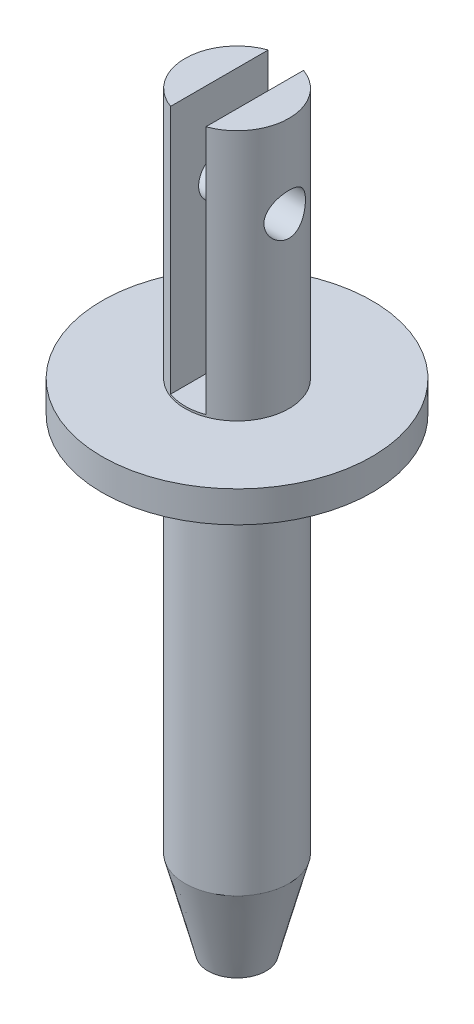
ISO-10303-21;
HEADER;
FILE_DESCRIPTION(('STEP AP214'),'2;1');
FILE_NAME('part.step','',(''),(''),'','','');
FILE_SCHEMA(('AUTOMOTIVE_DESIGN { 1 0 10303 214 1 1 1 1 }'));
ENDSEC;
DATA;
#1=APPLICATION_CONTEXT('core data for automotive mechanical design processes');
#2=APPLICATION_PROTOCOL_DEFINITION('international standard','automotive_design',2000,#1);
#3=PRODUCT_CONTEXT('',#1,'mechanical');
#4=PRODUCT('Part','Part','',(#3));
#5=PRODUCT_RELATED_PRODUCT_CATEGORY('part','',(#4));
#6=PRODUCT_DEFINITION_FORMATION('','',#4);
#7=PRODUCT_DEFINITION_CONTEXT('part definition',#1,'design');
#8=PRODUCT_DEFINITION('design','',#6,#7);
#9=PRODUCT_DEFINITION_SHAPE('','',#8);
#10=(LENGTH_UNIT() NAMED_UNIT(*) SI_UNIT(.MILLI.,.METRE.));
#11=(NAMED_UNIT(*) PLANE_ANGLE_UNIT() SI_UNIT($,.RADIAN.));
#12=(NAMED_UNIT(*) SI_UNIT($,.STERADIAN.) SOLID_ANGLE_UNIT());
#13=UNCERTAINTY_MEASURE_WITH_UNIT(LENGTH_MEASURE(1.E-05),#10,'distance_accuracy_value','');
#14=(GEOMETRIC_REPRESENTATION_CONTEXT(3) GLOBAL_UNCERTAINTY_ASSIGNED_CONTEXT((#13)) GLOBAL_UNIT_ASSIGNED_CONTEXT((#10,
#11,#12)) REPRESENTATION_CONTEXT('',''));
#15=CARTESIAN_POINT('',(0.,0.,0.));
#16=DIRECTION('',(0.,0.,1.));
#17=DIRECTION('',(1.,0.,0.));
#18=AXIS2_PLACEMENT_3D('',#15,#16,#17);
#19=CARTESIAN_POINT('',(0.,36.1,0.));
#20=DIRECTION('',(0.,-1.,0.));
#21=DIRECTION('',(0.,0.,-1.));
#22=AXIS2_PLACEMENT_3D('',#19,#20,#21);
#23=CYLINDRICAL_SURFACE('',#22,2.5);
#24=CARTESIAN_POINT('',(0.,22.4974323745046,0.));
#25=DIRECTION('',(0.,1.,0.));
#26=DIRECTION('',(0.,0.,1.));
#27=AXIS2_PLACEMENT_3D('',#24,#25,#26);
#28=CIRCLE('',#27,2.5);
#29=CARTESIAN_POINT('',(0.,22.4974323745046,2.5));
#30=VERTEX_POINT('',#29);
#31=EDGE_CURVE('E106',#30,#30,#28,.T.);
#32=ORIENTED_EDGE('',*,*,#31,.F.);
#33=EDGE_LOOP('',(#32));
#34=FACE_BOUND('',#33,.T.);
#35=CARTESIAN_POINT('',(0.,4.2000000000001,0.));
#36=DIRECTION('',(0.,1.,0.));
#37=DIRECTION('',(0.,0.,1.));
#38=AXIS2_PLACEMENT_3D('',#35,#36,#37);
#39=CIRCLE('',#38,2.5);
#40=CARTESIAN_POINT('',(0.,4.2000000000001,2.5));
#41=VERTEX_POINT('',#40);
#42=EDGE_CURVE('E41',#41,#41,#39,.T.);
#43=ORIENTED_EDGE('',*,*,#42,.T.);
#44=EDGE_LOOP('',(#43));
#45=FACE_BOUND('',#44,.T.);
#46=ADVANCED_FACE('F33',(#34,#45),#23,.T.);
#47=CARTESIAN_POINT('',(0.,0.,0.));
#48=DIRECTION('',(0.,1.,0.));
#49=DIRECTION('',(0.,0.,1.));
#50=AXIS2_PLACEMENT_3D('',#47,#48,#49);
#51=PLANE('',#50);
#52=CARTESIAN_POINT('',(0.,0.,0.));
#53=DIRECTION('',(0.,1.,0.));
#54=DIRECTION('',(0.,0.,1.));
#55=AXIS2_PLACEMENT_3D('',#52,#53,#54);
#56=CIRCLE('',#55,1.39999999999999);
#57=CARTESIAN_POINT('',(0.,0.,1.39999999999999));
#58=VERTEX_POINT('',#57);
#59=EDGE_CURVE('E11',#58,#58,#56,.F.);
#60=ORIENTED_EDGE('',*,*,#59,.T.);
#61=EDGE_LOOP('',(#60));
#62=FACE_BOUND('',#61,.T.);
#63=ADVANCED_FACE('F153',(#62),#51,.F.);
#64=CARTESIAN_POINT('',(0.,4.2000000000001,0.));
#65=DIRECTION('',(0.,1.,0.));
#66=DIRECTION('',(0.,0.,1.));
#67=AXIS2_PLACEMENT_3D('',#64,#65,#66);
#68=CONICAL_SURFACE('',#67,2.5,0.2561513825656);
#69=ORIENTED_EDGE('',*,*,#59,.F.);
#70=EDGE_LOOP('',(#69));
#71=FACE_BOUND('',#70,.T.);
#72=ORIENTED_EDGE('',*,*,#42,.F.);
#73=EDGE_LOOP('',(#72));
#74=FACE_BOUND('',#73,.T.);
#75=ADVANCED_FACE('F35',(#71,#74),#68,.T.);
#76=CARTESIAN_POINT('',(0.,22.4974323745046,2.5));
#77=DIRECTION('',(0.,-1.,0.));
#78=DIRECTION('',(0.,0.,-1.));
#79=AXIS2_PLACEMENT_3D('',#76,#77,#78);
#80=PLANE('',#79);
#81=ORIENTED_EDGE('',*,*,#31,.T.);
#82=EDGE_LOOP('',(#81));
#83=FACE_BOUND('',#82,.T.);
#84=CARTESIAN_POINT('',(0.,22.4974323745046,0.));
#85=DIRECTION('',(0.,1.,0.));
#86=DIRECTION('',(0.,0.,1.));
#87=AXIS2_PLACEMENT_3D('',#84,#85,#86);
#88=CIRCLE('',#87,6.5);
#89=CARTESIAN_POINT('',(0.,22.4974323745046,6.5));
#90=VERTEX_POINT('',#89);
#91=EDGE_CURVE('E185',#90,#90,#88,.T.);
#92=ORIENTED_EDGE('',*,*,#91,.F.);
#93=EDGE_LOOP('',(#92));
#94=FACE_BOUND('',#93,.T.);
#95=ADVANCED_FACE('F139',(#83,#94),#80,.T.);
#96=CARTESIAN_POINT('',(0.,50.,0.));
#97=DIRECTION('',(0.,1.,0.));
#98=DIRECTION('',(0.,0.,1.));
#99=AXIS2_PLACEMENT_3D('',#96,#97,#98);
#100=CYLINDRICAL_SURFACE('',#99,6.5);
#101=ORIENTED_EDGE('',*,*,#91,.T.);
#102=EDGE_LOOP('',(#101));
#103=FACE_BOUND('',#102,.T.);
#104=CARTESIAN_POINT('',(0.,23.9974323745046,0.));
#105=DIRECTION('',(0.,1.,0.));
#106=DIRECTION('',(0.,0.,1.));
#107=AXIS2_PLACEMENT_3D('',#104,#105,#106);
#108=CIRCLE('',#107,6.5);
#109=CARTESIAN_POINT('',(0.,23.9974323745046,6.5));
#110=VERTEX_POINT('',#109);
#111=EDGE_CURVE('E188',#110,#110,#108,.T.);
#112=ORIENTED_EDGE('',*,*,#111,.F.);
#113=EDGE_LOOP('',(#112));
#114=FACE_BOUND('',#113,.T.);
#115=ADVANCED_FACE('F195',(#103,#114),#100,.T.);
#116=CARTESIAN_POINT('',(0.,23.9974323745046,2.5));
#117=DIRECTION('',(0.,1.,0.));
#118=DIRECTION('',(0.,0.,1.));
#119=AXIS2_PLACEMENT_3D('',#116,#117,#118);
#120=PLANE('',#119);
#121=ORIENTED_EDGE('',*,*,#111,.T.);
#122=EDGE_LOOP('',(#121));
#123=FACE_BOUND('',#122,.T.);
#124=CARTESIAN_POINT('',(0.,23.9974323745046,0.));
#125=DIRECTION('',(0.,1.,0.));
#126=DIRECTION('',(0.,0.,1.));
#127=AXIS2_PLACEMENT_3D('',#124,#125,#126);
#128=CIRCLE('',#127,2.5);
#129=CARTESIAN_POINT('',(0.,23.9974323745046,2.5));
#130=VERTEX_POINT('',#129);
#131=EDGE_CURVE('E174',#130,#130,#128,.T.);
#132=ORIENTED_EDGE('',*,*,#131,.F.);
#133=EDGE_LOOP('',(#132));
#134=FACE_BOUND('',#133,.T.);
#135=ADVANCED_FACE('F152',(#123,#134),#120,.T.);
#136=CARTESIAN_POINT('',(0.,36.1,0.));
#137=DIRECTION('',(0.,1.,0.));
#138=DIRECTION('',(0.,0.,1.));
#139=AXIS2_PLACEMENT_3D('',#136,#137,#138);
#140=PLANE('',#139);
#141=DIRECTION('',(0.,0.,-1.));
#142=VECTOR('',#141,1.);
#143=CARTESIAN_POINT('',(0.85,36.1,0.));
#144=LINE('',#143,#142);
#145=CARTESIAN_POINT('',(0.85,36.1,2.35106358910175));
#146=VERTEX_POINT('',#145);
#147=CARTESIAN_POINT('',(0.85,36.1,-2.35106358910175));
#148=VERTEX_POINT('',#147);
#149=EDGE_CURVE('E73',#146,#148,#144,.T.);
#150=ORIENTED_EDGE('',*,*,#149,.F.);
#151=CARTESIAN_POINT('',(0.,36.1,0.));
#152=DIRECTION('',(0.,1.,0.));
#153=DIRECTION('',(0.,0.,1.));
#154=AXIS2_PLACEMENT_3D('',#151,#152,#153);
#155=CIRCLE('',#154,2.5);
#156=EDGE_CURVE('E82',#146,#148,#155,.T.);
#157=ORIENTED_EDGE('',*,*,#156,.T.);
#158=EDGE_LOOP('',(#150,#157));
#159=FACE_BOUND('',#158,.T.);
#160=ADVANCED_FACE('F92',(#159),#140,.T.);
#161=CARTESIAN_POINT('',(0.85,24.1,3.40914739194886));
#162=DIRECTION('',(1.,0.,0.));
#163=DIRECTION('',(0.,0.,-1.));
#164=AXIS2_PLACEMENT_3D('',#161,#162,#163);
#165=PLANE('',#164);
#166=CARTESIAN_POINT('',(0.85,32.1,0.));
#167=DIRECTION('',(1.,0.,0.));
#168=DIRECTION('',(0.,0.,-1.));
#169=AXIS2_PLACEMENT_3D('',#166,#167,#168);
#170=CIRCLE('',#169,1.);
#171=CARTESIAN_POINT('',(0.85,32.1,-1.));
#172=VERTEX_POINT('',#171);
#173=EDGE_CURVE('E103',#172,#172,#170,.T.);
#174=ORIENTED_EDGE('',*,*,#173,.T.);
#175=EDGE_LOOP('',(#174));
#176=FACE_BOUND('',#175,.T.);
#177=ORIENTED_EDGE('',*,*,#149,.T.);
#178=DIRECTION('',(0.,-1.,0.));
#179=VECTOR('',#178,1.);
#180=CARTESIAN_POINT('',(0.85,36.1,-2.35106358910175));
#181=LINE('',#180,#179);
#182=CARTESIAN_POINT('',(0.85,24.1,-2.35106358910175));
#183=VERTEX_POINT('',#182);
#184=EDGE_CURVE('E76',#183,#148,#181,.F.);
#185=ORIENTED_EDGE('',*,*,#184,.F.);
#186=DIRECTION('',(0.,0.,-1.));
#187=VECTOR('',#186,1.);
#188=CARTESIAN_POINT('',(0.85,24.1,3.40914739194886));
#189=LINE('',#188,#187);
#190=CARTESIAN_POINT('',(0.85,24.1,2.35106358910175));
#191=VERTEX_POINT('',#190);
#192=EDGE_CURVE('E90',#191,#183,#189,.T.);
#193=ORIENTED_EDGE('',*,*,#192,.F.);
#194=DIRECTION('',(0.,-1.,0.));
#195=VECTOR('',#194,1.);
#196=CARTESIAN_POINT('',(0.85,36.1,2.35106358910175));
#197=LINE('',#196,#195);
#198=EDGE_CURVE('E48',#146,#191,#197,.T.);
#199=ORIENTED_EDGE('',*,*,#198,.F.);
#200=EDGE_LOOP('',(#177,#185,#193,#199));
#201=FACE_BOUND('',#200,.T.);
#202=ADVANCED_FACE('F75',(#176,#201),#165,.F.);
#203=CARTESIAN_POINT('',(0.,24.1,0.));
#204=DIRECTION('',(0.,1.,0.));
#205=DIRECTION('',(0.,0.,1.));
#206=AXIS2_PLACEMENT_3D('',#203,#204,#205);
#207=PLANE('',#206);
#208=CARTESIAN_POINT('',(0.,24.1,0.));
#209=DIRECTION('',(0.,1.,0.));
#210=DIRECTION('',(0.,0.,1.));
#211=AXIS2_PLACEMENT_3D('',#208,#209,#210);
#212=CIRCLE('',#211,2.5);
#213=CARTESIAN_POINT('',(-0.85,24.1,-2.35106358910175));
#214=VERTEX_POINT('',#213);
#215=EDGE_CURVE('E89',#183,#214,#212,.T.);
#216=ORIENTED_EDGE('',*,*,#215,.T.);
#217=DIRECTION('',(0.,0.,1.));
#218=VECTOR('',#217,1.);
#219=CARTESIAN_POINT('',(-0.85,24.1,3.40914739194886));
#220=LINE('',#219,#218);
#221=CARTESIAN_POINT('',(-0.85,24.1,2.35106358910175));
#222=VERTEX_POINT('',#221);
#223=EDGE_CURVE('E112',#214,#222,#220,.T.);
#224=ORIENTED_EDGE('',*,*,#223,.T.);
#225=EDGE_CURVE('E101',#222,#191,#212,.T.);
#226=ORIENTED_EDGE('',*,*,#225,.T.);
#227=ORIENTED_EDGE('',*,*,#192,.T.);
#228=EDGE_LOOP('',(#216,#224,#226,#227));
#229=FACE_BOUND('',#228,.T.);
#230=ADVANCED_FACE('F111',(#229),#207,.T.);
#231=CARTESIAN_POINT('',(-0.85,24.1,3.40914739194886));
#232=DIRECTION('',(-1.,0.,0.));
#233=DIRECTION('',(0.,0.,1.));
#234=AXIS2_PLACEMENT_3D('',#231,#232,#233);
#235=PLANE('',#234);
#236=CARTESIAN_POINT('',(-0.85,32.1,0.));
#237=DIRECTION('',(-1.,0.,0.));
#238=DIRECTION('',(0.,0.,1.));
#239=AXIS2_PLACEMENT_3D('',#236,#237,#238);
#240=CIRCLE('',#239,1.);
#241=CARTESIAN_POINT('',(-0.85,32.1,1.));
#242=VERTEX_POINT('',#241);
#243=EDGE_CURVE('E105',#242,#242,#240,.T.);
#244=ORIENTED_EDGE('',*,*,#243,.T.);
#245=EDGE_LOOP('',(#244));
#246=FACE_BOUND('',#245,.T.);
#247=DIRECTION('',(0.,0.,1.));
#248=VECTOR('',#247,1.);
#249=CARTESIAN_POINT('',(-0.85,36.1,0.));
#250=LINE('',#249,#248);
#251=CARTESIAN_POINT('',(-0.85,36.1,-2.35106358910175));
#252=VERTEX_POINT('',#251);
#253=CARTESIAN_POINT('',(-0.85,36.1,2.35106358910175));
#254=VERTEX_POINT('',#253);
#255=EDGE_CURVE('E81',#252,#254,#250,.T.);
#256=ORIENTED_EDGE('',*,*,#255,.T.);
#257=DIRECTION('',(0.,-1.,0.));
#258=VECTOR('',#257,1.);
#259=CARTESIAN_POINT('',(-0.85,36.1,2.35106358910175));
#260=LINE('',#259,#258);
#261=EDGE_CURVE('E56',#222,#254,#260,.F.);
#262=ORIENTED_EDGE('',*,*,#261,.F.);
#263=ORIENTED_EDGE('',*,*,#223,.F.);
#264=DIRECTION('',(0.,-1.,0.));
#265=VECTOR('',#264,1.);
#266=CARTESIAN_POINT('',(-0.85,36.1,-2.35106358910175));
#267=LINE('',#266,#265);
#268=EDGE_CURVE('E96',#252,#214,#267,.T.);
#269=ORIENTED_EDGE('',*,*,#268,.F.);
#270=EDGE_LOOP('',(#256,#262,#263,#269));
#271=FACE_BOUND('',#270,.T.);
#272=ADVANCED_FACE('F114',(#246,#271),#235,.F.);
#273=ORIENTED_EDGE('',*,*,#255,.F.);
#274=EDGE_CURVE('E93',#252,#254,#155,.T.);
#275=ORIENTED_EDGE('',*,*,#274,.T.);
#276=EDGE_LOOP('',(#273,#275));
#277=FACE_BOUND('',#276,.T.);
#278=ADVANCED_FACE('F149',(#277),#140,.T.);
#279=CARTESIAN_POINT('',(-6.85,32.1,0.));
#280=DIRECTION('',(1.,0.,0.));
#281=DIRECTION('',(0.,0.,-1.));
#282=AXIS2_PLACEMENT_3D('',#279,#280,#281);
#283=CYLINDRICAL_SURFACE('',#282,1.);
#284=ORIENTED_EDGE('',*,*,#173,.F.);
#285=EDGE_LOOP('',(#284));
#286=FACE_BOUND('',#285,.T.);
#287=CARTESIAN_POINT('',(2.29128784747792,32.1,-1.));
#288=CARTESIAN_POINT('',(2.29129325828211,32.0464302509501,-0.999994127101894));
#289=CARTESIAN_POINT('',(2.29319301242132,31.9927847326476,-0.995669909297176));
#290=CARTESIAN_POINT('',(2.30055457093922,31.8870325835615,-0.978534515296366));
#291=CARTESIAN_POINT('',(2.30602547693426,31.8349302414598,-0.965701652221066));
#292=CARTESIAN_POINT('',(2.31980227895648,31.733973529015,-0.932117516284354));
#293=CARTESIAN_POINT('',(2.32809748178557,31.6851077263199,-0.911396076262715));
#294=CARTESIAN_POINT('',(2.3465733254764,31.5915574745702,-0.862710134685808));
#295=CARTESIAN_POINT('',(2.35675355451961,31.5468721154246,-0.834747214633751));
#296=CARTESIAN_POINT('',(2.37850432525516,31.4603697988793,-0.77066098729371));
#297=CARTESIAN_POINT('',(2.39011958979373,31.4188217885353,-0.734189678863665));
#298=CARTESIAN_POINT('',(2.41306228489405,31.3422355013423,-0.654854552887025));
#299=CARTESIAN_POINT('',(2.42438961368186,31.3071994993551,-0.611988510837844));
#300=CARTESIAN_POINT('',(2.44601703953427,31.2432968015087,-0.519003155178193));
#301=CARTESIAN_POINT('',(2.45625901841784,31.2147278492647,-0.468664482806144));
#302=CARTESIAN_POINT('',(2.47401963815773,31.1665782158051,-0.363412661437562));
#303=CARTESIAN_POINT('',(2.48153938692337,31.146993877109,-0.308501384643984));
#304=CARTESIAN_POINT('',(2.49269162504142,31.1183292567813,-0.198483213419449));
#305=CARTESIAN_POINT('',(2.49649468387678,31.1087863429555,-0.143514492402305));
#306=CARTESIAN_POINT('',(2.50040155341351,31.0989857571687,-0.032633164318828));
#307=CARTESIAN_POINT('',(2.50050674384656,31.0987246220326,0.0232790829126991));
#308=CARTESIAN_POINT('',(2.49710981410893,31.1072413848875,0.131116247357654));
#309=CARTESIAN_POINT('',(2.49380998385918,31.1155123863735,0.183088726437015));
#310=CARTESIAN_POINT('',(2.48424645734395,31.1399964381554,0.284836554609167));
#311=CARTESIAN_POINT('',(2.47798254360556,31.1562100712002,0.334611742195077));
#312=CARTESIAN_POINT('',(2.4629841222885,31.1963182414382,0.431448969255826));
#313=CARTESIAN_POINT('',(2.454213802334,31.2203248574078,0.478458811689816));
#314=CARTESIAN_POINT('',(2.43507292589849,31.2752325034595,0.567904075370287));
#315=CARTESIAN_POINT('',(2.42470182132537,31.3061358965488,0.610337921358053));
#316=CARTESIAN_POINT('',(2.40260818589167,31.3763245679733,0.692384413996074));
#317=CARTESIAN_POINT('',(2.3908416326012,31.4160269462919,0.731628922636821));
#318=CARTESIAN_POINT('',(2.36780830482389,31.5014952859105,0.803053707692664));
#319=CARTESIAN_POINT('',(2.35654169488173,31.5472632240771,0.83523167187983));
#320=CARTESIAN_POINT('',(2.33548448720906,31.6452095112045,0.892452094371466));
#321=CARTESIAN_POINT('',(2.3257445709069,31.6975324152419,0.917267325867452));
#322=CARTESIAN_POINT('',(2.30943795233662,31.806107745231,0.957588129983133));
#323=CARTESIAN_POINT('',(2.3028691896167,31.8623575923854,0.9730997492022));
#324=CARTESIAN_POINT('',(2.29414879836282,31.973517888718,0.99347747441598));
#325=CARTESIAN_POINT('',(2.29175183224038,32.0283002235601,0.998936048404205));
#326=CARTESIAN_POINT('',(2.29094748938549,32.138038603884,1.00078066322451));
#327=CARTESIAN_POINT('',(2.29253890281231,32.1929945916389,0.997169455296442));
#328=CARTESIAN_POINT('',(2.29928022178566,32.2982294674774,0.981516447394263));
#329=CARTESIAN_POINT('',(2.30422228898885,32.3485964686998,0.96996653101173));
#330=CARTESIAN_POINT('',(2.31685025513936,32.446644202393,0.93940209345564));
#331=CARTESIAN_POINT('',(2.32453676244372,32.4943243365537,0.920385917151197));
#332=CARTESIAN_POINT('',(2.34216890929975,32.5878011788977,0.874567819740727));
#333=CARTESIAN_POINT('',(2.35219352319567,32.6334430943472,0.847481434132298));
#334=CARTESIAN_POINT('',(2.37325192578919,32.7197414937208,0.786582612220938));
#335=CARTESIAN_POINT('',(2.38428612448031,32.7603959363978,0.752767436740991));
#336=CARTESIAN_POINT('',(2.40710457985699,32.8386867042996,0.67642210584024));
#337=CARTESIAN_POINT('',(2.41888403642601,32.8758782826455,0.633432714722548));
#338=CARTESIAN_POINT('',(2.44109897283781,32.9425885383052,0.541541816684422));
#339=CARTESIAN_POINT('',(2.4515343979662,32.9721069032986,0.492640069233933));
#340=CARTESIAN_POINT('',(2.46991857950142,33.0225238132306,0.390139967000885));
#341=CARTESIAN_POINT('',(2.47786793120137,33.0434244220829,0.336542740497038));
#342=CARTESIAN_POINT('',(2.49036356734645,33.0757744262038,0.226196795459617));
#343=CARTESIAN_POINT('',(2.49491169853772,33.08722895072,0.169449805147139));
#344=CARTESIAN_POINT('',(2.49989504105256,33.0997523508127,0.0584082551731554));
#345=CARTESIAN_POINT('',(2.50057923372436,33.1014500642313,0.00419524629653203));
#346=CARTESIAN_POINT('',(2.49843021189296,33.0960722603579,-0.103716917866617));
#347=CARTESIAN_POINT('',(2.49559752983456,33.0889980711072,-0.157416149697307));
#348=CARTESIAN_POINT('',(2.48685756682127,33.0667266058208,-0.261085450973202));
#349=CARTESIAN_POINT('',(2.48104740317165,33.0517855269622,-0.31111940232419));
#350=CARTESIAN_POINT('',(2.46697473916018,33.0144735977191,-0.407961177379468));
#351=CARTESIAN_POINT('',(2.45871178652006,32.9921013769898,-0.454768404133635));
#352=CARTESIAN_POINT('',(2.44009047180029,32.9394484007553,-0.546101520928054));
#353=CARTESIAN_POINT('',(2.42965564864115,32.9088618525575,-0.590435193403208));
#354=CARTESIAN_POINT('',(2.40794701593224,32.8411057404105,-0.673527014262032));
#355=CARTESIAN_POINT('',(2.3966728602525,32.80393345177,-0.712282842872876));
#356=CARTESIAN_POINT('',(2.37368881779711,32.7213423877375,-0.785600632542994));
#357=CARTESIAN_POINT('',(2.36199516302692,32.6755555632994,-0.819754443599512));
#358=CARTESIAN_POINT('',(2.3402483573759,32.5785289312856,-0.879923725219696));
#359=CARTESIAN_POINT('',(2.33019539943728,32.5272884835451,-0.905938238949993));
#360=CARTESIAN_POINT('',(2.31379432228954,32.425481399076,-0.946995543836653));
#361=CARTESIAN_POINT('',(2.30719459305824,32.3752673826244,-0.9628137570821));
#362=CARTESIAN_POINT('',(2.29723001801982,32.2727572901848,-0.98635887890919));
#363=CARTESIAN_POINT('',(2.29385616036088,32.2204674420165,-0.994108333944006));
#364=CARTESIAN_POINT('',(2.29162229378817,32.1453112188311,-0.999232129155087));
#365=CARTESIAN_POINT('',(2.29128555846678,32.1226623895012,-1.00000248449744));
#366=CARTESIAN_POINT('',(2.29128784747792,32.1,-1.));
#367=B_SPLINE_CURVE_WITH_KNOTS('',3,(#287,#288,#289,#290,#291,#292,#293,#294,#295,#296,#297,
#298,#299,#300,#301,#302,#303,#304,#305,#306,#307,#308,#309,#310,#311,#312,#313,#314,#315,#316,
#317,#318,#319,#320,#321,#322,#323,#324,#325,#326,#327,#328,#329,#330,#331,#332,#333,#334,#335,
#336,#337,#338,#339,#340,#341,#342,#343,#344,#345,#346,#347,#348,#349,#350,#351,#352,#353,#354,
#355,#356,#357,#358,#359,#360,#361,#362,#363,#364,#365,#366),.UNSPECIFIED.,.T.,.F.,(4,2,2,2,2,2,
2,2,2,2,2,2,2,2,2,2,2,2,2,2,2,2,2,2,2,2,2,2,2,2,2,2,2,2,2,2,2,2,2,4),(0.,0.160638824383831,
0.321688667911121,0.482135411646686,0.64254714411931,0.811278091422118,0.980067871741706,
1.15551334545714,1.3308873348474,1.49777091443592,1.66459222652836,1.82204322415151,
1.9795057756453,2.13934150117449,2.29923207470016,2.46962022040677,2.64006403563564,
2.81532229357288,2.99046652397055,3.15491073759215,3.31930507450974,3.47433624039577,
3.62940179322824,3.79075577323355,3.9521755725993,4.12551867120495,4.29886882423378,
4.47217743653411,4.64539187974073,4.80730519874981,4.96919400753306,5.12610997218681,
5.28305488911297,5.44693525566967,5.61088358279108,5.78498126639812,5.95909940876599,
6.11758330406542,6.27562315106626,6.34358052760367),.UNSPECIFIED.);
#368=CARTESIAN_POINT('',(2.29128784747792,32.1,-1.));
#369=VERTEX_POINT('',#368);
#370=EDGE_CURVE('E126',#369,#369,#367,.T.);
#371=ORIENTED_EDGE('',*,*,#370,.F.);
#372=EDGE_LOOP('',(#371));
#373=FACE_BOUND('',#372,.T.);
#374=ADVANCED_FACE('F137',(#286,#373),#283,.F.);
#375=ORIENTED_EDGE('',*,*,#243,.F.);
#376=EDGE_LOOP('',(#375));
#377=FACE_BOUND('',#376,.T.);
#378=CARTESIAN_POINT('',(-2.29128784747792,32.1,-1.));
#379=CARTESIAN_POINT('',(-2.29129325828211,32.15356974905,-0.999994127101894));
#380=CARTESIAN_POINT('',(-2.29319301242132,32.2072152673524,-0.995669909297176));
#381=CARTESIAN_POINT('',(-2.30055457093922,32.3129674164385,-0.978534515296366));
#382=CARTESIAN_POINT('',(-2.30602547693426,32.3650697585403,-0.965701652221066));
#383=CARTESIAN_POINT('',(-2.31980227895648,32.466026470985,-0.932117516284354));
#384=CARTESIAN_POINT('',(-2.32809748178557,32.5148922736801,-0.911396076262715));
#385=CARTESIAN_POINT('',(-2.3465733254764,32.6084425254298,-0.862710134685808));
#386=CARTESIAN_POINT('',(-2.35675355451961,32.6531278845754,-0.834747214633751));
#387=CARTESIAN_POINT('',(-2.37850432525516,32.7396302011207,-0.77066098729371));
#388=CARTESIAN_POINT('',(-2.39011958979373,32.7811782114647,-0.734189678863665));
#389=CARTESIAN_POINT('',(-2.41306228489405,32.8577644986577,-0.654854552887025));
#390=CARTESIAN_POINT('',(-2.42438961368186,32.8928005006449,-0.611988510837844));
#391=CARTESIAN_POINT('',(-2.44601703953427,32.9567031984914,-0.519003155178193));
#392=CARTESIAN_POINT('',(-2.45625901841784,32.9852721507353,-0.468664482806145));
#393=CARTESIAN_POINT('',(-2.47401963815773,33.0334217841949,-0.363412661437565));
#394=CARTESIAN_POINT('',(-2.48153938692337,33.053006122891,-0.308501384643986));
#395=CARTESIAN_POINT('',(-2.49269162504142,33.0816707432187,-0.198483213419451));
#396=CARTESIAN_POINT('',(-2.49649468387678,33.0912136570445,-0.143514492402308));
#397=CARTESIAN_POINT('',(-2.50040155341351,33.1010142428313,-0.0326331643188303));
#398=CARTESIAN_POINT('',(-2.50050674384656,33.1012753779674,0.0232790829126975));
#399=CARTESIAN_POINT('',(-2.49710981410893,33.0927586151125,0.131116247357653));
#400=CARTESIAN_POINT('',(-2.49380998385918,33.0844876136265,0.183088726437014));
#401=CARTESIAN_POINT('',(-2.48424645734395,33.0600035618446,0.284836554609167));
#402=CARTESIAN_POINT('',(-2.47798254360556,33.0437899287998,0.334611742195077));
#403=CARTESIAN_POINT('',(-2.4629841222885,33.0036817585619,0.431448969255824));
#404=CARTESIAN_POINT('',(-2.454213802334,32.9796751425922,0.478458811689813));
#405=CARTESIAN_POINT('',(-2.43507292589849,32.9247674965405,0.567904075370283));
#406=CARTESIAN_POINT('',(-2.42470182132537,32.8938641034512,0.610337921358051));
#407=CARTESIAN_POINT('',(-2.40260818589167,32.8236754320267,0.692384413996072));
#408=CARTESIAN_POINT('',(-2.3908416326012,32.7839730537081,0.731628922636816));
#409=CARTESIAN_POINT('',(-2.36780830482389,32.6985047140895,0.803053707692658));
#410=CARTESIAN_POINT('',(-2.35654169488173,32.6527367759229,0.835231671879826));
#411=CARTESIAN_POINT('',(-2.33548448720906,32.5547904887955,0.892452094371464));
#412=CARTESIAN_POINT('',(-2.3257445709069,32.5024675847581,0.91726732586745));
#413=CARTESIAN_POINT('',(-2.30943795233662,32.393892254769,0.957588129983131));
#414=CARTESIAN_POINT('',(-2.3028691896167,32.3376424076146,0.973099749202199));
#415=CARTESIAN_POINT('',(-2.29414879836282,32.226482111282,0.99347747441598));
#416=CARTESIAN_POINT('',(-2.29175183224038,32.1716997764399,0.998936048404206));
#417=CARTESIAN_POINT('',(-2.29094748938549,32.061961396116,1.00078066322451));
#418=CARTESIAN_POINT('',(-2.29253890281231,32.0070054083611,0.997169455296441));
#419=CARTESIAN_POINT('',(-2.29928022178566,31.9017705325226,0.981516447394262));
#420=CARTESIAN_POINT('',(-2.30422228898885,31.8514035313003,0.969966531011729));
#421=CARTESIAN_POINT('',(-2.31685025513936,31.753355797607,0.93940209345564));
#422=CARTESIAN_POINT('',(-2.32453676244372,31.7056756634463,0.920385917151197));
#423=CARTESIAN_POINT('',(-2.34216890929975,31.6121988211023,0.874567819740727));
#424=CARTESIAN_POINT('',(-2.35219352319567,31.5665569056528,0.847481434132298));
#425=CARTESIAN_POINT('',(-2.37325192578919,31.4802585062792,0.786582612220938));
#426=CARTESIAN_POINT('',(-2.38428612448031,31.4396040636022,0.752767436740991));
#427=CARTESIAN_POINT('',(-2.40710457985699,31.3613132957004,0.67642210584024));
#428=CARTESIAN_POINT('',(-2.41888403642601,31.3241217173545,0.633432714722548));
#429=CARTESIAN_POINT('',(-2.44109897283781,31.2574114616948,0.541541816684421));
#430=CARTESIAN_POINT('',(-2.4515343979662,31.2278930967014,0.492640069233933));
#431=CARTESIAN_POINT('',(-2.46991857950142,31.1774761867694,0.390139967000883));
#432=CARTESIAN_POINT('',(-2.47786793120137,31.1565755779171,0.336542740497035));
#433=CARTESIAN_POINT('',(-2.49036356734645,31.1242255737962,0.226196795459614));
#434=CARTESIAN_POINT('',(-2.49491169853772,31.11277104928,0.169449805147136));
#435=CARTESIAN_POINT('',(-2.49989504105256,31.1002476491873,0.0584082551731532));
#436=CARTESIAN_POINT('',(-2.50057923372436,31.0985499357687,0.00419524629652905));
#437=CARTESIAN_POINT('',(-2.49843021189296,31.1039277396421,-0.10371691786662));
#438=CARTESIAN_POINT('',(-2.49559752983456,31.1110019288928,-0.157416149697309));
#439=CARTESIAN_POINT('',(-2.48685756682127,31.1332733941792,-0.261085450973204));
#440=CARTESIAN_POINT('',(-2.48104740317165,31.1482144730378,-0.311119402324191));
#441=CARTESIAN_POINT('',(-2.46697473916019,31.1855264022809,-0.407961177379469));
#442=CARTESIAN_POINT('',(-2.45871178652006,31.2078986230102,-0.454768404133637));
#443=CARTESIAN_POINT('',(-2.44009047180029,31.2605515992447,-0.546101520928055));
#444=CARTESIAN_POINT('',(-2.42965564864115,31.2911381474425,-0.590435193403209));
#445=CARTESIAN_POINT('',(-2.40794701593224,31.3588942595895,-0.673527014262033));
#446=CARTESIAN_POINT('',(-2.3966728602525,31.3960665482301,-0.712282842872876));
#447=CARTESIAN_POINT('',(-2.37368881779711,31.4786576122625,-0.785600632542995));
#448=CARTESIAN_POINT('',(-2.36199516302692,31.5244444367006,-0.819754443599513));
#449=CARTESIAN_POINT('',(-2.3402483573759,31.6214710687144,-0.879923725219698));
#450=CARTESIAN_POINT('',(-2.33019539943728,31.6727115164549,-0.905938238949994));
#451=CARTESIAN_POINT('',(-2.31379432228954,31.774518600924,-0.946995543836655));
#452=CARTESIAN_POINT('',(-2.30719459305824,31.8247326173756,-0.962813757082103));
#453=CARTESIAN_POINT('',(-2.29723001801982,31.9272427098152,-0.986358878909192));
#454=CARTESIAN_POINT('',(-2.29385616036088,31.9795325579835,-0.994108333944007));
#455=CARTESIAN_POINT('',(-2.29162229378817,32.054688781169,-0.999232129155087));
#456=CARTESIAN_POINT('',(-2.29128555846678,32.0773376104988,-1.00000248449744));
#457=CARTESIAN_POINT('',(-2.29128784747792,32.1,-1.));
#458=B_SPLINE_CURVE_WITH_KNOTS('',3,(#378,#379,#380,#381,#382,#383,#384,#385,#386,#387,#388,
#389,#390,#391,#392,#393,#394,#395,#396,#397,#398,#399,#400,#401,#402,#403,#404,#405,#406,#407,
#408,#409,#410,#411,#412,#413,#414,#415,#416,#417,#418,#419,#420,#421,#422,#423,#424,#425,#426,
#427,#428,#429,#430,#431,#432,#433,#434,#435,#436,#437,#438,#439,#440,#441,#442,#443,#444,#445,
#446,#447,#448,#449,#450,#451,#452,#453,#454,#455,#456,#457),.UNSPECIFIED.,.T.,.F.,(4,2,2,2,2,2,
2,2,2,2,2,2,2,2,2,2,2,2,2,2,2,2,2,2,2,2,2,2,2,2,2,2,2,2,2,2,2,2,2,4),(0.,0.160638824383831,
0.321688667911121,0.482135411646686,0.64254714411931,0.811278091422118,0.980067871741706,
1.15551334545714,1.3308873348474,1.49777091443591,1.66459222652836,1.82204322415151,
1.9795057756453,2.13934150117448,2.29923207470015,2.46962022040677,2.64006403563563,
2.81532229357288,2.99046652397056,3.15491073759216,3.31930507450975,3.47433624039577,
3.62940179322824,3.79075577323355,3.9521755725993,4.12551867120495,4.29886882423379,
4.47217743653411,4.64539187974073,4.80730519874982,4.96919400753306,5.12610997218681,
5.28305488911298,5.44693525566967,5.61088358279108,5.78498126639812,5.959099408766,
6.11758330406543,6.27562315106626,6.34358052760367),.UNSPECIFIED.);
#459=CARTESIAN_POINT('',(-2.29128784747792,32.1,-1.));
#460=VERTEX_POINT('',#459);
#461=EDGE_CURVE('E116',#460,#460,#458,.T.);
#462=ORIENTED_EDGE('',*,*,#461,.F.);
#463=EDGE_LOOP('',(#462));
#464=FACE_BOUND('',#463,.T.);
#465=ADVANCED_FACE('F132',(#377,#464),#283,.F.);
#466=ORIENTED_EDGE('',*,*,#131,.T.);
#467=EDGE_LOOP('',(#466));
#468=FACE_BOUND('',#467,.T.);
#469=ORIENTED_EDGE('',*,*,#461,.T.);
#470=EDGE_LOOP('',(#469));
#471=FACE_BOUND('',#470,.T.);
#472=ORIENTED_EDGE('',*,*,#370,.T.);
#473=EDGE_LOOP('',(#472));
#474=FACE_BOUND('',#473,.T.);
#475=ORIENTED_EDGE('',*,*,#274,.F.);
#476=ORIENTED_EDGE('',*,*,#268,.T.);
#477=ORIENTED_EDGE('',*,*,#215,.F.);
#478=ORIENTED_EDGE('',*,*,#184,.T.);
#479=ORIENTED_EDGE('',*,*,#156,.F.);
#480=ORIENTED_EDGE('',*,*,#198,.T.);
#481=ORIENTED_EDGE('',*,*,#225,.F.);
#482=ORIENTED_EDGE('',*,*,#261,.T.);
#483=EDGE_LOOP('',(#475,#476,#477,#478,#479,#480,#481,#482));
#484=FACE_BOUND('',#483,.T.);
#485=ADVANCED_FACE('F87',(#468,#471,#474,#484),#23,.T.);
#486=CLOSED_SHELL('',(#46,#63,#75,#95,#115,#135,#160,#202,#230,#272,#278,#374,#465,#485));
#487=MANIFOLD_SOLID_BREP('B2',#486);
#488=ADVANCED_BREP_SHAPE_REPRESENTATION('',(#18,#487),#14);
#489=SHAPE_DEFINITION_REPRESENTATION(#9,#488);
ENDSEC;
END-ISO-10303-21;
